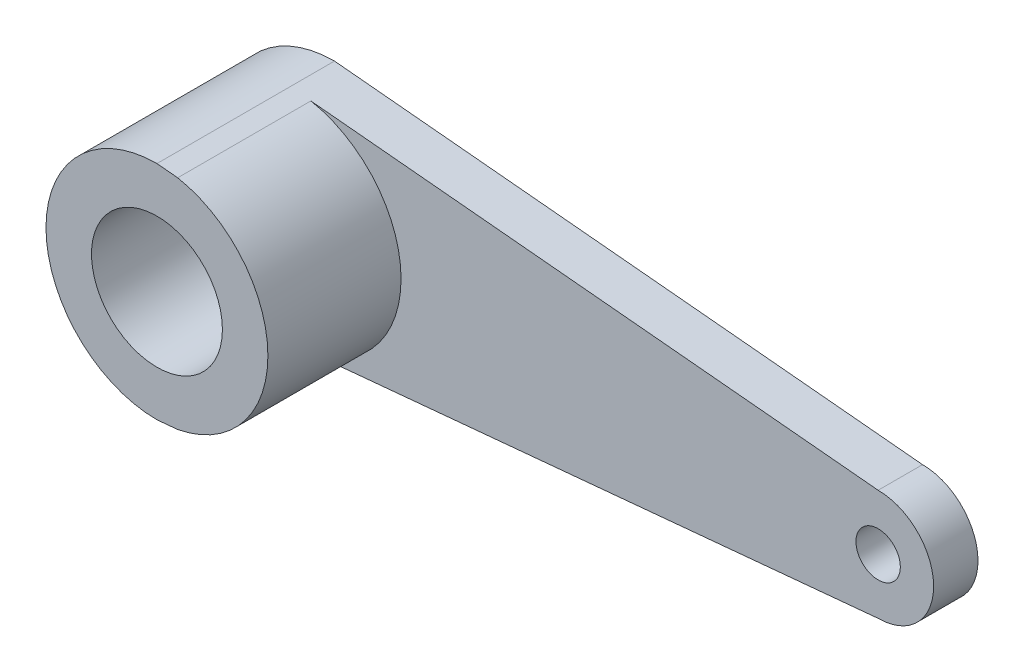
ISO-10303-21;
HEADER;
FILE_DESCRIPTION(('STEP AP214'),'2;1');
FILE_NAME('part.step','',(''),(''),'','','');
FILE_SCHEMA(('AUTOMOTIVE_DESIGN { 1 0 10303 214 1 1 1 1 }'));
ENDSEC;
DATA;
#1=APPLICATION_CONTEXT('core data for automotive mechanical design processes');
#2=APPLICATION_PROTOCOL_DEFINITION('international standard','automotive_design',2000,#1);
#3=PRODUCT_CONTEXT('',#1,'mechanical');
#4=PRODUCT('Part','Part','',(#3));
#5=PRODUCT_RELATED_PRODUCT_CATEGORY('part','',(#4));
#6=PRODUCT_DEFINITION_FORMATION('','',#4);
#7=PRODUCT_DEFINITION_CONTEXT('part definition',#1,'design');
#8=PRODUCT_DEFINITION('design','',#6,#7);
#9=PRODUCT_DEFINITION_SHAPE('','',#8);
#10=(LENGTH_UNIT() NAMED_UNIT(*) SI_UNIT(.MILLI.,.METRE.));
#11=(NAMED_UNIT(*) PLANE_ANGLE_UNIT() SI_UNIT($,.RADIAN.));
#12=(NAMED_UNIT(*) SI_UNIT($,.STERADIAN.) SOLID_ANGLE_UNIT());
#13=UNCERTAINTY_MEASURE_WITH_UNIT(LENGTH_MEASURE(1.E-05),#10,'distance_accuracy_value','');
#14=(GEOMETRIC_REPRESENTATION_CONTEXT(3) GLOBAL_UNCERTAINTY_ASSIGNED_CONTEXT((#13)) GLOBAL_UNIT_ASSIGNED_CONTEXT((#10,
#11,#12)) REPRESENTATION_CONTEXT('',''));
#15=CARTESIAN_POINT('',(0.,0.,0.));
#16=DIRECTION('',(0.,0.,1.));
#17=DIRECTION('',(1.,0.,0.));
#18=AXIS2_PLACEMENT_3D('',#15,#16,#17);
#19=CARTESIAN_POINT('',(26.5,0.,8.));
#20=DIRECTION('',(0.,0.,-1.));
#21=DIRECTION('',(-1.,0.,0.));
#22=AXIS2_PLACEMENT_3D('',#19,#20,#21);
#23=CYLINDRICAL_SURFACE('',#22,2.5);
#24=DIRECTION('',(0.,0.,-1.));
#25=VECTOR('',#24,1.);
#26=CARTESIAN_POINT('',(26.5,2.5,8.));
#27=LINE('',#26,#25);
#28=CARTESIAN_POINT('',(26.5,2.5,2.));
#29=VERTEX_POINT('',#28);
#30=CARTESIAN_POINT('',(26.5,2.5,0.));
#31=VERTEX_POINT('',#30);
#32=EDGE_CURVE('E11',#29,#31,#27,.T.);
#33=ORIENTED_EDGE('',*,*,#32,.F.);
#34=CARTESIAN_POINT('',(26.5,0.,2.));
#35=DIRECTION('',(0.,0.,1.));
#36=DIRECTION('',(1.,0.,0.));
#37=AXIS2_PLACEMENT_3D('',#34,#35,#36);
#38=CIRCLE('',#37,2.5);
#39=CARTESIAN_POINT('',(26.5,-2.5,2.));
#40=VERTEX_POINT('',#39);
#41=EDGE_CURVE('E95',#40,#29,#38,.T.);
#42=ORIENTED_EDGE('',*,*,#41,.F.);
#43=DIRECTION('',(0.,0.,-1.));
#44=VECTOR('',#43,1.);
#45=CARTESIAN_POINT('',(26.5,-2.5,8.));
#46=LINE('',#45,#44);
#47=CARTESIAN_POINT('',(26.5,-2.5,0.));
#48=VERTEX_POINT('',#47);
#49=EDGE_CURVE('E88',#40,#48,#46,.T.);
#50=ORIENTED_EDGE('',*,*,#49,.T.);
#51=CARTESIAN_POINT('',(26.5,0.,0.));
#52=DIRECTION('',(0.,0.,1.));
#53=DIRECTION('',(1.,0.,0.));
#54=AXIS2_PLACEMENT_3D('',#51,#52,#53);
#55=CIRCLE('',#54,2.5);
#56=EDGE_CURVE('E91',#31,#48,#55,.F.);
#57=ORIENTED_EDGE('',*,*,#56,.F.);
#58=EDGE_LOOP('',(#33,#42,#50,#57));
#59=FACE_BOUND('',#58,.T.);
#60=ADVANCED_FACE('F44',(#59),#23,.T.);
#61=CARTESIAN_POINT('',(0.467537050105857,4.95589273112209,8.));
#62=DIRECTION('',(0.0939225945956681,0.995579502714082,0.));
#63=DIRECTION('',(-0.995579502714081,0.0939225945956681,0.));
#64=AXIS2_PLACEMENT_3D('',#61,#62,#63);
#65=PLANE('',#64);
#66=DIRECTION('',(0.995579502714082,-0.0939225945956681,0.));
#67=VECTOR('',#66,1.);
#68=CARTESIAN_POINT('',(0.467537050105857,4.95589273112209,8.));
#69=LINE('',#68,#67);
#70=CARTESIAN_POINT('',(0.,5.,8.));
#71=VERTEX_POINT('',#70);
#72=CARTESIAN_POINT('',(0.935074100211703,4.91178546224418,8.));
#73=VERTEX_POINT('',#72);
#74=EDGE_CURVE('E123',#71,#73,#69,.T.);
#75=ORIENTED_EDGE('',*,*,#74,.T.);
#76=DIRECTION('',(0.,0.,1.));
#77=VECTOR('',#76,1.);
#78=CARTESIAN_POINT('',(0.935074100211702,4.91178546224418,2.));
#79=LINE('',#78,#77);
#80=CARTESIAN_POINT('',(0.935074100211702,4.91178546224418,2.));
#81=VERTEX_POINT('',#80);
#82=EDGE_CURVE('E60',#81,#73,#79,.T.);
#83=ORIENTED_EDGE('',*,*,#82,.F.);
#84=DIRECTION('',(-0.995579502714082,0.0939225945956681,0.));
#85=VECTOR('',#84,1.);
#86=CARTESIAN_POINT('',(0.467537050105858,4.95589273112209,2.));
#87=LINE('',#86,#85);
#88=EDGE_CURVE('E169',#29,#81,#87,.T.);
#89=ORIENTED_EDGE('',*,*,#88,.F.);
#90=ORIENTED_EDGE('',*,*,#32,.T.);
#91=DIRECTION('',(0.995579502714082,-0.0939225945956681,0.));
#92=VECTOR('',#91,1.);
#93=CARTESIAN_POINT('',(0.467537050105857,4.95589273112209,0.));
#94=LINE('',#93,#92);
#95=CARTESIAN_POINT('',(0.,5.,0.));
#96=VERTEX_POINT('',#95);
#97=EDGE_CURVE('E109',#96,#31,#94,.T.);
#98=ORIENTED_EDGE('',*,*,#97,.F.);
#99=DIRECTION('',(0.,0.,-1.));
#100=VECTOR('',#99,1.);
#101=CARTESIAN_POINT('',(0.,5.,8.));
#102=LINE('',#101,#100);
#103=EDGE_CURVE('E53',#71,#96,#102,.T.);
#104=ORIENTED_EDGE('',*,*,#103,.F.);
#105=EDGE_LOOP('',(#75,#83,#89,#90,#98,#104));
#106=FACE_BOUND('',#105,.T.);
#107=ADVANCED_FACE('F137',(#106),#65,.T.);
#108=CARTESIAN_POINT('',(0.467537050105857,-4.95589273112209,8.));
#109=DIRECTION('',(0.0939225945956681,-0.995579502714082,0.));
#110=DIRECTION('',(0.995579502714081,0.0939225945956681,0.));
#111=AXIS2_PLACEMENT_3D('',#108,#109,#110);
#112=PLANE('',#111);
#113=DIRECTION('',(0.995579502714082,0.0939225945956681,0.));
#114=VECTOR('',#113,1.);
#115=CARTESIAN_POINT('',(0.467537050105858,-4.95589273112209,2.));
#116=LINE('',#115,#114);
#117=CARTESIAN_POINT('',(0.935074100211702,-4.91178546224418,2.));
#118=VERTEX_POINT('',#117);
#119=EDGE_CURVE('E162',#118,#40,#116,.T.);
#120=ORIENTED_EDGE('',*,*,#119,.F.);
#121=DIRECTION('',(0.,0.,1.));
#122=VECTOR('',#121,1.);
#123=CARTESIAN_POINT('',(0.935074100211702,-4.91178546224418,2.));
#124=LINE('',#123,#122);
#125=CARTESIAN_POINT('',(0.935074100211702,-4.91178546224418,8.));
#126=VERTEX_POINT('',#125);
#127=EDGE_CURVE('E144',#118,#126,#124,.T.);
#128=ORIENTED_EDGE('',*,*,#127,.T.);
#129=DIRECTION('',(-0.995579502714082,-0.0939225945956681,0.));
#130=VECTOR('',#129,1.);
#131=CARTESIAN_POINT('',(0.467537050105857,-4.95589273112209,8.));
#132=LINE('',#131,#130);
#133=CARTESIAN_POINT('',(0.,-5.,8.));
#134=VERTEX_POINT('',#133);
#135=EDGE_CURVE('E69',#126,#134,#132,.T.);
#136=ORIENTED_EDGE('',*,*,#135,.T.);
#137=DIRECTION('',(0.,0.,-1.));
#138=VECTOR('',#137,1.);
#139=CARTESIAN_POINT('',(0.,-5.,8.));
#140=LINE('',#139,#138);
#141=CARTESIAN_POINT('',(0.,-5.,0.));
#142=VERTEX_POINT('',#141);
#143=EDGE_CURVE('E99',#134,#142,#140,.T.);
#144=ORIENTED_EDGE('',*,*,#143,.T.);
#145=DIRECTION('',(-0.995579502714082,-0.0939225945956681,0.));
#146=VECTOR('',#145,1.);
#147=CARTESIAN_POINT('',(0.467537050105857,-4.95589273112209,0.));
#148=LINE('',#147,#146);
#149=EDGE_CURVE('E107',#48,#142,#148,.T.);
#150=ORIENTED_EDGE('',*,*,#149,.F.);
#151=ORIENTED_EDGE('',*,*,#49,.F.);
#152=EDGE_LOOP('',(#120,#128,#136,#144,#150,#151));
#153=FACE_BOUND('',#152,.T.);
#154=ADVANCED_FACE('F113',(#153),#112,.T.);
#155=CARTESIAN_POINT('',(26.5,0.,8.));
#156=DIRECTION('',(0.,0.,-1.));
#157=DIRECTION('',(-1.,0.,0.));
#158=AXIS2_PLACEMENT_3D('',#155,#156,#157);
#159=CYLINDRICAL_SURFACE('',#158,1.);
#160=CARTESIAN_POINT('',(26.5,0.,0.));
#161=DIRECTION('',(0.,0.,1.));
#162=DIRECTION('',(1.,0.,0.));
#163=AXIS2_PLACEMENT_3D('',#160,#161,#162);
#164=CIRCLE('',#163,1.);
#165=CARTESIAN_POINT('',(27.5,0.,0.));
#166=VERTEX_POINT('',#165);
#167=EDGE_CURVE('E111',#166,#166,#164,.T.);
#168=ORIENTED_EDGE('',*,*,#167,.F.);
#169=EDGE_LOOP('',(#168));
#170=FACE_BOUND('',#169,.T.);
#171=CARTESIAN_POINT('',(26.5,0.,2.));
#172=DIRECTION('',(0.,0.,1.));
#173=DIRECTION('',(1.,0.,0.));
#174=AXIS2_PLACEMENT_3D('',#171,#172,#173);
#175=CIRCLE('',#174,1.);
#176=CARTESIAN_POINT('',(27.5,0.,2.));
#177=VERTEX_POINT('',#176);
#178=EDGE_CURVE('E156',#177,#177,#175,.F.);
#179=ORIENTED_EDGE('',*,*,#178,.F.);
#180=EDGE_LOOP('',(#179));
#181=FACE_BOUND('',#180,.T.);
#182=ADVANCED_FACE('F46',(#170,#181),#159,.F.);
#183=CARTESIAN_POINT('',(0.,0.,8.));
#184=DIRECTION('',(0.,0.,1.));
#185=DIRECTION('',(1.,0.,0.));
#186=AXIS2_PLACEMENT_3D('',#183,#184,#185);
#187=PLANE('',#186);
#188=CARTESIAN_POINT('',(0.,0.,8.));
#189=DIRECTION('',(0.,0.,1.));
#190=DIRECTION('',(1.,0.,0.));
#191=AXIS2_PLACEMENT_3D('',#188,#189,#190);
#192=CIRCLE('',#191,2.95);
#193=CARTESIAN_POINT('',(2.95,0.,8.));
#194=VERTEX_POINT('',#193);
#195=EDGE_CURVE('E100',#194,#194,#192,.T.);
#196=ORIENTED_EDGE('',*,*,#195,.F.);
#197=EDGE_LOOP('',(#196));
#198=FACE_BOUND('',#197,.T.);
#199=ORIENTED_EDGE('',*,*,#135,.F.);
#200=CARTESIAN_POINT('',(0.,0.,8.));
#201=DIRECTION('',(0.,0.,1.));
#202=DIRECTION('',(1.,0.,0.));
#203=AXIS2_PLACEMENT_3D('',#200,#201,#202);
#204=CIRCLE('',#203,5.);
#205=EDGE_CURVE('E159',#126,#73,#204,.T.);
#206=ORIENTED_EDGE('',*,*,#205,.T.);
#207=ORIENTED_EDGE('',*,*,#74,.F.);
#208=CARTESIAN_POINT('',(0.,0.,8.));
#209=DIRECTION('',(0.,0.,1.));
#210=DIRECTION('',(1.,0.,0.));
#211=AXIS2_PLACEMENT_3D('',#208,#209,#210);
#212=CIRCLE('',#211,5.);
#213=EDGE_CURVE('E133',#71,#134,#212,.T.);
#214=ORIENTED_EDGE('',*,*,#213,.T.);
#215=EDGE_LOOP('',(#199,#206,#207,#214));
#216=FACE_BOUND('',#215,.T.);
#217=ADVANCED_FACE('F191',(#198,#216),#187,.T.);
#218=CARTESIAN_POINT('',(0.,0.,8.));
#219=DIRECTION('',(0.,0.,-1.));
#220=DIRECTION('',(-1.,0.,0.));
#221=AXIS2_PLACEMENT_3D('',#218,#219,#220);
#222=CYLINDRICAL_SURFACE('',#221,5.);
#223=CARTESIAN_POINT('',(0.,0.,0.));
#224=DIRECTION('',(0.,0.,1.));
#225=DIRECTION('',(1.,0.,0.));
#226=AXIS2_PLACEMENT_3D('',#223,#224,#225);
#227=CIRCLE('',#226,5.);
#228=EDGE_CURVE('E118',#96,#142,#227,.T.);
#229=ORIENTED_EDGE('',*,*,#228,.T.);
#230=ORIENTED_EDGE('',*,*,#143,.F.);
#231=ORIENTED_EDGE('',*,*,#213,.F.);
#232=ORIENTED_EDGE('',*,*,#103,.T.);
#233=EDGE_LOOP('',(#229,#230,#231,#232));
#234=FACE_BOUND('',#233,.T.);
#235=ADVANCED_FACE('F132',(#234),#222,.T.);
#236=CARTESIAN_POINT('',(0.,0.,8.));
#237=DIRECTION('',(0.,0.,-1.));
#238=DIRECTION('',(-1.,0.,0.));
#239=AXIS2_PLACEMENT_3D('',#236,#237,#238);
#240=CYLINDRICAL_SURFACE('',#239,2.95);
#241=ORIENTED_EDGE('',*,*,#195,.T.);
#242=EDGE_LOOP('',(#241));
#243=FACE_BOUND('',#242,.T.);
#244=CARTESIAN_POINT('',(0.,0.,0.));
#245=DIRECTION('',(0.,0.,1.));
#246=DIRECTION('',(1.,0.,0.));
#247=AXIS2_PLACEMENT_3D('',#244,#245,#246);
#248=CIRCLE('',#247,2.95);
#249=CARTESIAN_POINT('',(2.95,0.,0.));
#250=VERTEX_POINT('',#249);
#251=EDGE_CURVE('E117',#250,#250,#248,.T.);
#252=ORIENTED_EDGE('',*,*,#251,.F.);
#253=EDGE_LOOP('',(#252));
#254=FACE_BOUND('',#253,.T.);
#255=ADVANCED_FACE('F200',(#243,#254),#240,.F.);
#256=CARTESIAN_POINT('',(0.,0.,0.));
#257=DIRECTION('',(0.,0.,1.));
#258=DIRECTION('',(1.,0.,0.));
#259=AXIS2_PLACEMENT_3D('',#256,#257,#258);
#260=PLANE('',#259);
#261=ORIENTED_EDGE('',*,*,#167,.T.);
#262=EDGE_LOOP('',(#261));
#263=FACE_BOUND('',#262,.T.);
#264=ORIENTED_EDGE('',*,*,#56,.T.);
#265=ORIENTED_EDGE('',*,*,#149,.T.);
#266=ORIENTED_EDGE('',*,*,#228,.F.);
#267=ORIENTED_EDGE('',*,*,#97,.T.);
#268=EDGE_LOOP('',(#264,#265,#266,#267));
#269=FACE_BOUND('',#268,.T.);
#270=ORIENTED_EDGE('',*,*,#251,.T.);
#271=EDGE_LOOP('',(#270));
#272=FACE_BOUND('',#271,.T.);
#273=ADVANCED_FACE('F104',(#263,#269,#272),#260,.F.);
#274=CARTESIAN_POINT('',(0.,0.,2.));
#275=DIRECTION('',(0.,0.,1.));
#276=DIRECTION('',(1.,0.,0.));
#277=AXIS2_PLACEMENT_3D('',#274,#275,#276);
#278=CYLINDRICAL_SURFACE('',#277,5.);
#279=ORIENTED_EDGE('',*,*,#205,.F.);
#280=ORIENTED_EDGE('',*,*,#127,.F.);
#281=CARTESIAN_POINT('',(0.,0.,2.));
#282=DIRECTION('',(0.,0.,1.));
#283=DIRECTION('',(1.,0.,0.));
#284=AXIS2_PLACEMENT_3D('',#281,#282,#283);
#285=CIRCLE('',#284,5.);
#286=EDGE_CURVE('E166',#118,#81,#285,.T.);
#287=ORIENTED_EDGE('',*,*,#286,.T.);
#288=ORIENTED_EDGE('',*,*,#82,.T.);
#289=EDGE_LOOP('',(#279,#280,#287,#288));
#290=FACE_BOUND('',#289,.T.);
#291=ADVANCED_FACE('F189',(#290),#278,.T.);
#292=CARTESIAN_POINT('',(0.,0.,2.));
#293=DIRECTION('',(0.,0.,1.));
#294=DIRECTION('',(1.,0.,0.));
#295=AXIS2_PLACEMENT_3D('',#292,#293,#294);
#296=PLANE('',#295);
#297=ORIENTED_EDGE('',*,*,#119,.T.);
#298=ORIENTED_EDGE('',*,*,#41,.T.);
#299=ORIENTED_EDGE('',*,*,#88,.T.);
#300=ORIENTED_EDGE('',*,*,#286,.F.);
#301=EDGE_LOOP('',(#297,#298,#299,#300));
#302=FACE_BOUND('',#301,.T.);
#303=ORIENTED_EDGE('',*,*,#178,.T.);
#304=EDGE_LOOP('',(#303));
#305=FACE_BOUND('',#304,.T.);
#306=ADVANCED_FACE('F179',(#302,#305),#296,.T.);
#307=CLOSED_SHELL('',(#60,#107,#154,#182,#217,#235,#255,#273,#291,#306));
#308=MANIFOLD_SOLID_BREP('B2',#307);
#309=ADVANCED_BREP_SHAPE_REPRESENTATION('',(#18,#308),#14);
#310=SHAPE_DEFINITION_REPRESENTATION(#9,#309);
ENDSEC;
END-ISO-10303-21;
